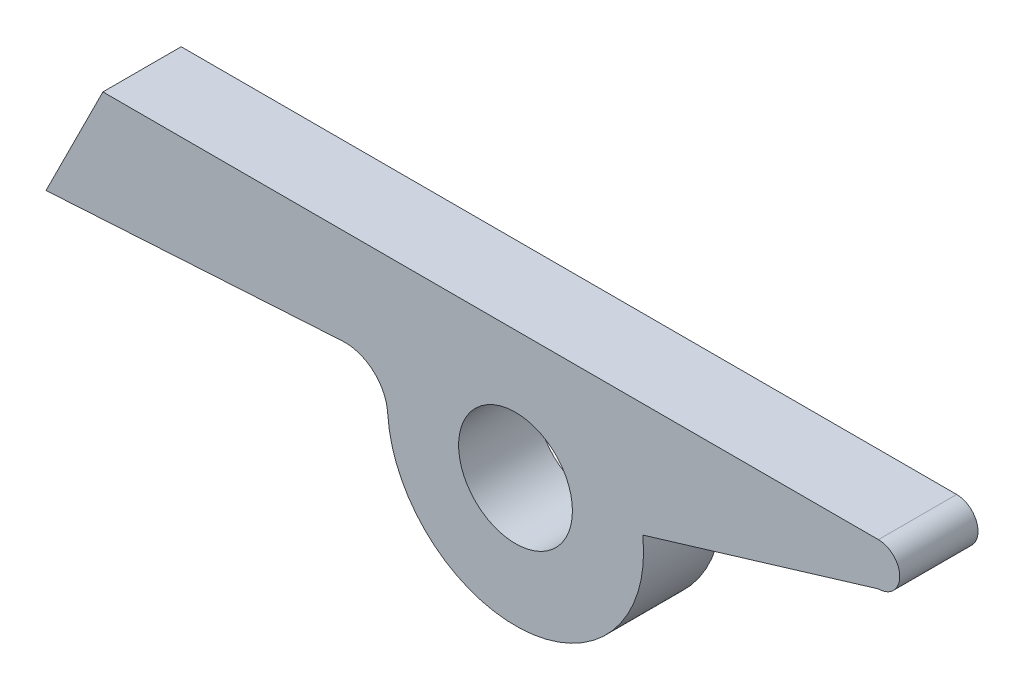
ISO-10303-21;
HEADER;
FILE_DESCRIPTION(('STEP AP214'),'2;1');
FILE_NAME('part.step','',(''),(''),'','','');
FILE_SCHEMA(('AUTOMOTIVE_DESIGN { 1 0 10303 214 1 1 1 1 }'));
ENDSEC;
DATA;
#1=APPLICATION_CONTEXT('core data for automotive mechanical design processes');
#2=APPLICATION_PROTOCOL_DEFINITION('international standard','automotive_design',2000,#1);
#3=PRODUCT_CONTEXT('',#1,'mechanical');
#4=PRODUCT('Part','Part','',(#3));
#5=PRODUCT_RELATED_PRODUCT_CATEGORY('part','',(#4));
#6=PRODUCT_DEFINITION_FORMATION('','',#4);
#7=PRODUCT_DEFINITION_CONTEXT('part definition',#1,'design');
#8=PRODUCT_DEFINITION('design','',#6,#7);
#9=PRODUCT_DEFINITION_SHAPE('','',#8);
#10=(LENGTH_UNIT() NAMED_UNIT(*) SI_UNIT(.MILLI.,.METRE.));
#11=(NAMED_UNIT(*) PLANE_ANGLE_UNIT() SI_UNIT($,.RADIAN.));
#12=(NAMED_UNIT(*) SI_UNIT($,.STERADIAN.) SOLID_ANGLE_UNIT());
#13=UNCERTAINTY_MEASURE_WITH_UNIT(LENGTH_MEASURE(1.E-05),#10,'distance_accuracy_value','');
#14=(GEOMETRIC_REPRESENTATION_CONTEXT(3) GLOBAL_UNCERTAINTY_ASSIGNED_CONTEXT((#13)) GLOBAL_UNIT_ASSIGNED_CONTEXT((#10,
#11,#12)) REPRESENTATION_CONTEXT('',''));
#15=CARTESIAN_POINT('',(0.,0.,0.));
#16=DIRECTION('',(0.,0.,1.));
#17=DIRECTION('',(1.,0.,0.));
#18=AXIS2_PLACEMENT_3D('',#15,#16,#17);
#19=CARTESIAN_POINT('',(-10.23,-9.74,5.5));
#20=DIRECTION('',(0.,0.,1.));
#21=DIRECTION('',(1.,0.,0.));
#22=AXIS2_PLACEMENT_3D('',#19,#20,#21);
#23=PLANE('',#22);
#24=DIRECTION('',(-0.447213595499958,-0.894427190999916,0.));
#25=VECTOR('',#24,1.);
#26=CARTESIAN_POINT('',(-27.25,0.,5.5));
#27=LINE('',#26,#25);
#28=CARTESIAN_POINT('',(-27.25,0.,5.5));
#29=VERTEX_POINT('',#28);
#30=CARTESIAN_POINT('',(-31.25,-8.,5.5));
#31=VERTEX_POINT('',#30);
#32=EDGE_CURVE('E155',#29,#31,#27,.T.);
#33=ORIENTED_EDGE('',*,*,#32,.T.);
#34=DIRECTION('',(0.998192812310569,0.0600925074490776,0.));
#35=VECTOR('',#34,1.);
#36=CARTESIAN_POINT('',(-31.25,-8.,5.5));
#37=LINE('',#36,#35);
#38=CARTESIAN_POINT('',(-10.4102775223472,-6.74542156306829,5.5));
#39=VERTEX_POINT('',#38);
#40=EDGE_CURVE('E97',#31,#39,#37,.T.);
#41=ORIENTED_EDGE('',*,*,#40,.T.);
#42=CARTESIAN_POINT('',(-10.23,-9.74,5.5));
#43=DIRECTION('',(0.,0.,-1.));
#44=DIRECTION('',(1.,0.,0.));
#45=AXIS2_PLACEMENT_3D('',#42,#43,#44);
#46=CIRCLE('',#45,3.);
#47=CARTESIAN_POINT('',(-7.23570959992188,-9.555,5.5));
#48=VERTEX_POINT('',#47);
#49=EDGE_CURVE('E172',#39,#48,#46,.T.);
#50=ORIENTED_EDGE('',*,*,#49,.T.);
#51=CARTESIAN_POINT('',(1.74716160031249,-9.,5.5));
#52=DIRECTION('',(0.,0.,1.));
#53=DIRECTION('',(1.,0.,0.));
#54=AXIS2_PLACEMENT_3D('',#51,#52,#53);
#55=CIRCLE('',#54,9.);
#56=CARTESIAN_POINT('',(10.6914335103116,-8.,5.5));
#57=VERTEX_POINT('',#56);
#58=EDGE_CURVE('E113',#48,#57,#55,.T.);
#59=ORIENTED_EDGE('',*,*,#58,.T.);
#60=DIRECTION('',(0.957308714604478,0.289067509316289,0.));
#61=VECTOR('',#60,1.);
#62=CARTESIAN_POINT('',(10.6914335103116,-8.,5.5));
#63=LINE('',#62,#61);
#64=CARTESIAN_POINT('',(27.25,-3.,5.5));
#65=VERTEX_POINT('',#64);
#66=EDGE_CURVE('E107',#57,#65,#63,.T.);
#67=ORIENTED_EDGE('',*,*,#66,.T.);
#68=CARTESIAN_POINT('',(27.25,-1.5,5.5));
#69=DIRECTION('',(0.,0.,1.));
#70=DIRECTION('',(1.,0.,0.));
#71=AXIS2_PLACEMENT_3D('',#68,#69,#70);
#72=CIRCLE('',#71,1.5);
#73=CARTESIAN_POINT('',(27.25,0.,5.5));
#74=VERTEX_POINT('',#73);
#75=EDGE_CURVE('E111',#65,#74,#72,.T.);
#76=ORIENTED_EDGE('',*,*,#75,.T.);
#77=DIRECTION('',(-1.,0.,0.));
#78=VECTOR('',#77,1.);
#79=CARTESIAN_POINT('',(-27.25,0.,5.5));
#80=LINE('',#79,#78);
#81=EDGE_CURVE('E57',#74,#29,#80,.T.);
#82=ORIENTED_EDGE('',*,*,#81,.T.);
#83=EDGE_LOOP('',(#33,#41,#50,#59,#67,#76,#82));
#84=FACE_BOUND('',#83,.T.);
#85=CARTESIAN_POINT('',(1.74716160031249,-9.,5.5));
#86=DIRECTION('',(0.,0.,1.));
#87=DIRECTION('',(1.,0.,0.));
#88=AXIS2_PLACEMENT_3D('',#85,#86,#87);
#89=CIRCLE('',#88,4.);
#90=CARTESIAN_POINT('',(5.74716160031249,-9.,5.5));
#91=VERTEX_POINT('',#90);
#92=EDGE_CURVE('E140',#91,#91,#89,.T.);
#93=ORIENTED_EDGE('',*,*,#92,.F.);
#94=EDGE_LOOP('',(#93));
#95=FACE_BOUND('',#94,.T.);
#96=ADVANCED_FACE('F39',(#84,#95),#23,.T.);
#97=CARTESIAN_POINT('',(-10.23,-9.74,0.));
#98=DIRECTION('',(0.,0.,1.));
#99=DIRECTION('',(1.,0.,0.));
#100=AXIS2_PLACEMENT_3D('',#97,#98,#99);
#101=PLANE('',#100);
#102=DIRECTION('',(-0.447213595499958,-0.894427190999916,0.));
#103=VECTOR('',#102,1.);
#104=CARTESIAN_POINT('',(-27.25,0.,0.));
#105=LINE('',#104,#103);
#106=CARTESIAN_POINT('',(-27.25,0.,0.));
#107=VERTEX_POINT('',#106);
#108=CARTESIAN_POINT('',(-31.25,-8.,0.));
#109=VERTEX_POINT('',#108);
#110=EDGE_CURVE('E135',#107,#109,#105,.T.);
#111=ORIENTED_EDGE('',*,*,#110,.F.);
#112=DIRECTION('',(-1.,0.,0.));
#113=VECTOR('',#112,1.);
#114=CARTESIAN_POINT('',(-27.25,0.,0.));
#115=LINE('',#114,#113);
#116=CARTESIAN_POINT('',(27.25,0.,0.));
#117=VERTEX_POINT('',#116);
#118=EDGE_CURVE('E89',#117,#107,#115,.T.);
#119=ORIENTED_EDGE('',*,*,#118,.F.);
#120=CARTESIAN_POINT('',(27.25,-1.5,0.));
#121=DIRECTION('',(0.,0.,1.));
#122=DIRECTION('',(1.,0.,0.));
#123=AXIS2_PLACEMENT_3D('',#120,#121,#122);
#124=CIRCLE('',#123,1.5);
#125=CARTESIAN_POINT('',(27.25,-3.,0.));
#126=VERTEX_POINT('',#125);
#127=EDGE_CURVE('E83',#126,#117,#124,.T.);
#128=ORIENTED_EDGE('',*,*,#127,.F.);
#129=DIRECTION('',(0.957308714604478,0.289067509316289,0.));
#130=VECTOR('',#129,1.);
#131=CARTESIAN_POINT('',(10.6914335103116,-8.,0.));
#132=LINE('',#131,#130);
#133=CARTESIAN_POINT('',(10.6914335103116,-8.,0.));
#134=VERTEX_POINT('',#133);
#135=EDGE_CURVE('E122',#134,#126,#132,.T.);
#136=ORIENTED_EDGE('',*,*,#135,.F.);
#137=CARTESIAN_POINT('',(1.74716160031249,-9.,0.));
#138=DIRECTION('',(0.,0.,1.));
#139=DIRECTION('',(1.,0.,0.));
#140=AXIS2_PLACEMENT_3D('',#137,#138,#139);
#141=CIRCLE('',#140,9.);
#142=CARTESIAN_POINT('',(-7.23570959992188,-9.555,0.));
#143=VERTEX_POINT('',#142);
#144=EDGE_CURVE('E146',#143,#134,#141,.T.);
#145=ORIENTED_EDGE('',*,*,#144,.F.);
#146=CARTESIAN_POINT('',(-10.23,-9.74,0.));
#147=DIRECTION('',(0.,0.,-1.));
#148=DIRECTION('',(1.,0.,0.));
#149=AXIS2_PLACEMENT_3D('',#146,#147,#148);
#150=CIRCLE('',#149,3.);
#151=CARTESIAN_POINT('',(-10.4102775223472,-6.74542156306829,0.));
#152=VERTEX_POINT('',#151);
#153=EDGE_CURVE('E143',#152,#143,#150,.T.);
#154=ORIENTED_EDGE('',*,*,#153,.F.);
#155=DIRECTION('',(0.998192812310569,0.0600925074490776,0.));
#156=VECTOR('',#155,1.);
#157=CARTESIAN_POINT('',(-31.25,-8.,0.));
#158=LINE('',#157,#156);
#159=EDGE_CURVE('E139',#109,#152,#158,.T.);
#160=ORIENTED_EDGE('',*,*,#159,.F.);
#161=EDGE_LOOP('',(#111,#119,#128,#136,#145,#154,#160));
#162=FACE_BOUND('',#161,.T.);
#163=CARTESIAN_POINT('',(1.74716160031249,-9.,0.));
#164=DIRECTION('',(0.,0.,1.));
#165=DIRECTION('',(1.,0.,0.));
#166=AXIS2_PLACEMENT_3D('',#163,#164,#165);
#167=CIRCLE('',#166,4.);
#168=CARTESIAN_POINT('',(5.74716160031249,-9.,0.));
#169=VERTEX_POINT('',#168);
#170=EDGE_CURVE('E188',#169,#169,#167,.T.);
#171=ORIENTED_EDGE('',*,*,#170,.T.);
#172=EDGE_LOOP('',(#171));
#173=FACE_BOUND('',#172,.T.);
#174=ADVANCED_FACE('F176',(#162,#173),#101,.F.);
#175=CARTESIAN_POINT('',(-27.25,0.,5.5));
#176=DIRECTION('',(0.894427190999916,-0.447213595499958,0.));
#177=DIRECTION('',(0.447213595499958,0.894427190999916,0.));
#178=AXIS2_PLACEMENT_3D('',#175,#176,#177);
#179=PLANE('',#178);
#180=ORIENTED_EDGE('',*,*,#110,.T.);
#181=DIRECTION('',(0.,0.,-1.));
#182=VECTOR('',#181,1.);
#183=CARTESIAN_POINT('',(-31.25,-8.,5.5));
#184=LINE('',#183,#182);
#185=EDGE_CURVE('E11',#31,#109,#184,.T.);
#186=ORIENTED_EDGE('',*,*,#185,.F.);
#187=ORIENTED_EDGE('',*,*,#32,.F.);
#188=DIRECTION('',(0.,0.,-1.));
#189=VECTOR('',#188,1.);
#190=CARTESIAN_POINT('',(-27.25,0.,5.5));
#191=LINE('',#190,#189);
#192=EDGE_CURVE('E131',#29,#107,#191,.T.);
#193=ORIENTED_EDGE('',*,*,#192,.T.);
#194=EDGE_LOOP('',(#180,#186,#187,#193));
#195=FACE_BOUND('',#194,.T.);
#196=ADVANCED_FACE('F41',(#195),#179,.F.);
#197=CARTESIAN_POINT('',(-31.25,-8.,5.5));
#198=DIRECTION('',(-0.0600925074490776,0.998192812310569,0.));
#199=DIRECTION('',(-0.998192812310569,-0.0600925074490776,0.));
#200=AXIS2_PLACEMENT_3D('',#197,#198,#199);
#201=PLANE('',#200);
#202=ORIENTED_EDGE('',*,*,#159,.T.);
#203=DIRECTION('',(0.,0.,-1.));
#204=VECTOR('',#203,1.);
#205=CARTESIAN_POINT('',(-10.4102775223472,-6.74542156306829,5.5));
#206=LINE('',#205,#204);
#207=EDGE_CURVE('E49',#39,#152,#206,.T.);
#208=ORIENTED_EDGE('',*,*,#207,.F.);
#209=ORIENTED_EDGE('',*,*,#40,.F.);
#210=ORIENTED_EDGE('',*,*,#185,.T.);
#211=EDGE_LOOP('',(#202,#208,#209,#210));
#212=FACE_BOUND('',#211,.T.);
#213=ADVANCED_FACE('F216',(#212),#201,.F.);
#214=CARTESIAN_POINT('',(-10.23,-9.74,5.5));
#215=DIRECTION('',(0.,0.,-1.));
#216=DIRECTION('',(-1.,0.,0.));
#217=AXIS2_PLACEMENT_3D('',#214,#215,#216);
#218=CYLINDRICAL_SURFACE('',#217,3.);
#219=ORIENTED_EDGE('',*,*,#153,.T.);
#220=DIRECTION('',(0.,0.,-1.));
#221=VECTOR('',#220,1.);
#222=CARTESIAN_POINT('',(-7.23570959992188,-9.555,5.5));
#223=LINE('',#222,#221);
#224=EDGE_CURVE('E162',#48,#143,#223,.T.);
#225=ORIENTED_EDGE('',*,*,#224,.F.);
#226=ORIENTED_EDGE('',*,*,#49,.F.);
#227=ORIENTED_EDGE('',*,*,#207,.T.);
#228=EDGE_LOOP('',(#219,#225,#226,#227));
#229=FACE_BOUND('',#228,.T.);
#230=ADVANCED_FACE('F170',(#229),#218,.F.);
#231=CARTESIAN_POINT('',(1.74716160031249,-9.,5.5));
#232=DIRECTION('',(0.,0.,-1.));
#233=DIRECTION('',(-1.,0.,0.));
#234=AXIS2_PLACEMENT_3D('',#231,#232,#233);
#235=CYLINDRICAL_SURFACE('',#234,9.);
#236=ORIENTED_EDGE('',*,*,#144,.T.);
#237=DIRECTION('',(0.,0.,-1.));
#238=VECTOR('',#237,1.);
#239=CARTESIAN_POINT('',(10.6914335103116,-8.,5.5));
#240=LINE('',#239,#238);
#241=EDGE_CURVE('E124',#57,#134,#240,.T.);
#242=ORIENTED_EDGE('',*,*,#241,.F.);
#243=ORIENTED_EDGE('',*,*,#58,.F.);
#244=ORIENTED_EDGE('',*,*,#224,.T.);
#245=EDGE_LOOP('',(#236,#242,#243,#244));
#246=FACE_BOUND('',#245,.T.);
#247=ADVANCED_FACE('F179',(#246),#235,.T.);
#248=CARTESIAN_POINT('',(10.6914335103116,-8.,5.5));
#249=DIRECTION('',(-0.289067509316289,0.957308714604478,0.));
#250=DIRECTION('',(-0.957308714604478,-0.289067509316289,0.));
#251=AXIS2_PLACEMENT_3D('',#248,#249,#250);
#252=PLANE('',#251);
#253=ORIENTED_EDGE('',*,*,#135,.T.);
#254=DIRECTION('',(0.,0.,-1.));
#255=VECTOR('',#254,1.);
#256=CARTESIAN_POINT('',(27.25,-3.,5.5));
#257=LINE('',#256,#255);
#258=EDGE_CURVE('E119',#65,#126,#257,.T.);
#259=ORIENTED_EDGE('',*,*,#258,.F.);
#260=ORIENTED_EDGE('',*,*,#66,.F.);
#261=ORIENTED_EDGE('',*,*,#241,.T.);
#262=EDGE_LOOP('',(#253,#259,#260,#261));
#263=FACE_BOUND('',#262,.T.);
#264=ADVANCED_FACE('F120',(#263),#252,.F.);
#265=CARTESIAN_POINT('',(27.25,-1.5,5.5));
#266=DIRECTION('',(0.,0.,-1.));
#267=DIRECTION('',(-1.,0.,0.));
#268=AXIS2_PLACEMENT_3D('',#265,#266,#267);
#269=CYLINDRICAL_SURFACE('',#268,1.5);
#270=ORIENTED_EDGE('',*,*,#127,.T.);
#271=DIRECTION('',(0.,0.,-1.));
#272=VECTOR('',#271,1.);
#273=CARTESIAN_POINT('',(27.25,0.,5.5));
#274=LINE('',#273,#272);
#275=EDGE_CURVE('E125',#74,#117,#274,.T.);
#276=ORIENTED_EDGE('',*,*,#275,.F.);
#277=ORIENTED_EDGE('',*,*,#75,.F.);
#278=ORIENTED_EDGE('',*,*,#258,.T.);
#279=EDGE_LOOP('',(#270,#276,#277,#278));
#280=FACE_BOUND('',#279,.T.);
#281=ADVANCED_FACE('F127',(#280),#269,.T.);
#282=CARTESIAN_POINT('',(-27.25,0.,5.5));
#283=DIRECTION('',(0.,-1.,0.));
#284=DIRECTION('',(0.,0.,-1.));
#285=AXIS2_PLACEMENT_3D('',#282,#283,#284);
#286=PLANE('',#285);
#287=ORIENTED_EDGE('',*,*,#118,.T.);
#288=ORIENTED_EDGE('',*,*,#192,.F.);
#289=ORIENTED_EDGE('',*,*,#81,.F.);
#290=ORIENTED_EDGE('',*,*,#275,.T.);
#291=EDGE_LOOP('',(#287,#288,#289,#290));
#292=FACE_BOUND('',#291,.T.);
#293=ADVANCED_FACE('F206',(#292),#286,.F.);
#294=CARTESIAN_POINT('',(1.74716160031249,-9.,5.5));
#295=DIRECTION('',(0.,0.,-1.));
#296=DIRECTION('',(-1.,0.,0.));
#297=AXIS2_PLACEMENT_3D('',#294,#295,#296);
#298=CYLINDRICAL_SURFACE('',#297,4.);
#299=ORIENTED_EDGE('',*,*,#92,.T.);
#300=EDGE_LOOP('',(#299));
#301=FACE_BOUND('',#300,.T.);
#302=ORIENTED_EDGE('',*,*,#170,.F.);
#303=EDGE_LOOP('',(#302));
#304=FACE_BOUND('',#303,.T.);
#305=ADVANCED_FACE('F196',(#301,#304),#298,.F.);
#306=CLOSED_SHELL('',(#96,#174,#196,#213,#230,#247,#264,#281,#293,#305));
#307=MANIFOLD_SOLID_BREP('B2',#306);
#308=ADVANCED_BREP_SHAPE_REPRESENTATION('',(#18,#307),#14);
#309=SHAPE_DEFINITION_REPRESENTATION(#9,#308);
ENDSEC;
END-ISO-10303-21;
